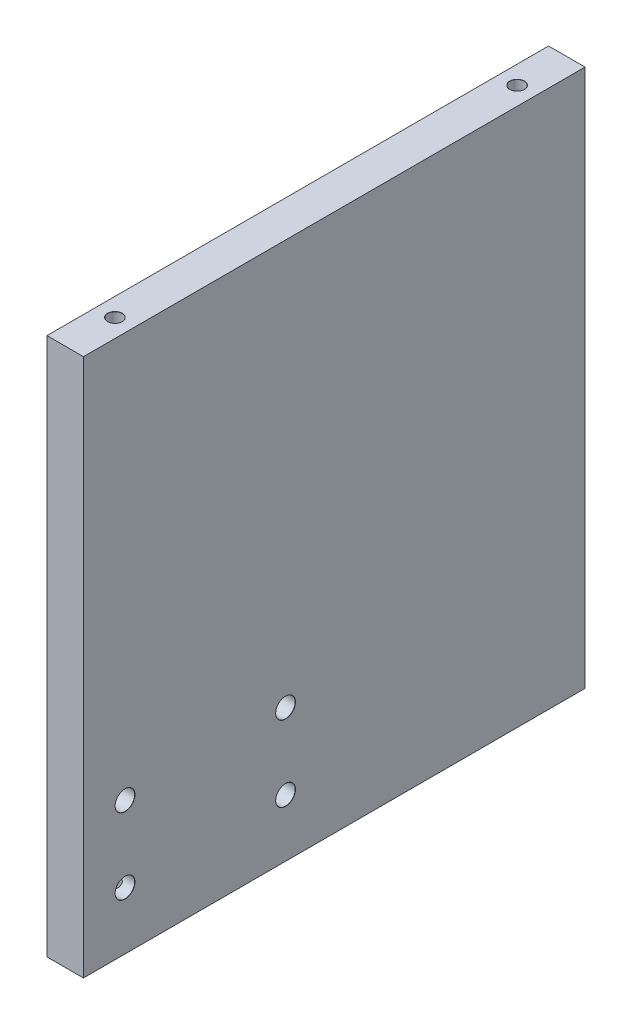
ISO-10303-21;
HEADER;
FILE_DESCRIPTION(('STEP AP214'),'2;1');
FILE_NAME('part.step','',(''),(''),'','','');
FILE_SCHEMA(('AUTOMOTIVE_DESIGN { 1 0 10303 214 1 1 1 1 }'));
ENDSEC;
DATA;
#1=APPLICATION_CONTEXT('core data for automotive mechanical design processes');
#2=APPLICATION_PROTOCOL_DEFINITION('international standard','automotive_design',2000,#1);
#3=PRODUCT_CONTEXT('',#1,'mechanical');
#4=PRODUCT('Part','Part','',(#3));
#5=PRODUCT_RELATED_PRODUCT_CATEGORY('part','',(#4));
#6=PRODUCT_DEFINITION_FORMATION('','',#4);
#7=PRODUCT_DEFINITION_CONTEXT('part definition',#1,'design');
#8=PRODUCT_DEFINITION('design','',#6,#7);
#9=PRODUCT_DEFINITION_SHAPE('','',#8);
#10=(LENGTH_UNIT() NAMED_UNIT(*) SI_UNIT(.MILLI.,.METRE.));
#11=(NAMED_UNIT(*) PLANE_ANGLE_UNIT() SI_UNIT($,.RADIAN.));
#12=(NAMED_UNIT(*) SI_UNIT($,.STERADIAN.) SOLID_ANGLE_UNIT());
#13=UNCERTAINTY_MEASURE_WITH_UNIT(LENGTH_MEASURE(1.E-05),#10,'distance_accuracy_value','');
#14=(GEOMETRIC_REPRESENTATION_CONTEXT(3) GLOBAL_UNCERTAINTY_ASSIGNED_CONTEXT((#13)) GLOBAL_UNIT_ASSIGNED_CONTEXT((#10,
#11,#12)) REPRESENTATION_CONTEXT('',''));
#15=CARTESIAN_POINT('',(0.,0.,0.));
#16=DIRECTION('',(0.,0.,1.));
#17=DIRECTION('',(1.,0.,0.));
#18=AXIS2_PLACEMENT_3D('',#15,#16,#17);
#19=CARTESIAN_POINT('',(0.,0.,0.));
#20=DIRECTION('',(-1.,0.,0.));
#21=DIRECTION('',(0.,0.,1.));
#22=AXIS2_PLACEMENT_3D('',#19,#20,#21);
#23=PLANE('',#22);
#24=CARTESIAN_POINT('',(0.,-23.655,36.41));
#25=DIRECTION('',(1.,0.,0.));
#26=DIRECTION('',(0.,0.,-1.));
#27=AXIS2_PLACEMENT_3D('',#24,#25,#26);
#28=CIRCLE('',#27,1.7);
#29=CARTESIAN_POINT('',(0.,-23.655,34.71));
#30=VERTEX_POINT('',#29);
#31=EDGE_CURVE('E507',#30,#30,#28,.T.);
#32=ORIENTED_EDGE('',*,*,#31,.T.);
#33=EDGE_LOOP('',(#32));
#34=FACE_BOUND('',#33,.T.);
#35=DIRECTION('',(0.,1.,0.));
#36=VECTOR('',#35,1.);
#37=CARTESIAN_POINT('',(0.,-46.825,-43.65));
#38=LINE('',#37,#36);
#39=CARTESIAN_POINT('',(0.,-46.825,-43.65));
#40=VERTEX_POINT('',#39);
#41=CARTESIAN_POINT('',(0.,46.825,-43.65));
#42=VERTEX_POINT('',#41);
#43=EDGE_CURVE('E176',#40,#42,#38,.T.);
#44=ORIENTED_EDGE('',*,*,#43,.F.);
#45=DIRECTION('',(0.,0.,-1.));
#46=VECTOR('',#45,1.);
#47=CARTESIAN_POINT('',(0.,-46.825,43.65));
#48=LINE('',#47,#46);
#49=CARTESIAN_POINT('',(0.,-46.825,43.65));
#50=VERTEX_POINT('',#49);
#51=EDGE_CURVE('E100',#50,#40,#48,.T.);
#52=ORIENTED_EDGE('',*,*,#51,.F.);
#53=DIRECTION('',(0.,-1.,0.));
#54=VECTOR('',#53,1.);
#55=CARTESIAN_POINT('',(0.,-46.825,43.65));
#56=LINE('',#55,#54);
#57=CARTESIAN_POINT('',(0.,46.825,43.65));
#58=VERTEX_POINT('',#57);
#59=EDGE_CURVE('E194',#58,#50,#56,.T.);
#60=ORIENTED_EDGE('',*,*,#59,.F.);
#61=DIRECTION('',(0.,0.,1.));
#62=VECTOR('',#61,1.);
#63=CARTESIAN_POINT('',(0.,46.825,43.65));
#64=LINE('',#63,#62);
#65=EDGE_CURVE('E191',#42,#58,#64,.T.);
#66=ORIENTED_EDGE('',*,*,#65,.F.);
#67=EDGE_LOOP('',(#44,#52,#60,#66));
#68=FACE_BOUND('',#67,.T.);
#69=CARTESIAN_POINT('',(0.,-36.825,36.41));
#70=DIRECTION('',(1.,0.,0.));
#71=DIRECTION('',(0.,0.,-1.));
#72=AXIS2_PLACEMENT_3D('',#69,#70,#71);
#73=CIRCLE('',#72,1.7);
#74=CARTESIAN_POINT('',(0.,-36.825,34.71));
#75=VERTEX_POINT('',#74);
#76=EDGE_CURVE('E128',#75,#75,#73,.T.);
#77=ORIENTED_EDGE('',*,*,#76,.T.);
#78=EDGE_LOOP('',(#77));
#79=FACE_BOUND('',#78,.T.);
#80=CARTESIAN_POINT('',(0.,-36.825,8.47));
#81=DIRECTION('',(1.,0.,0.));
#82=DIRECTION('',(0.,0.,-1.));
#83=AXIS2_PLACEMENT_3D('',#80,#81,#82);
#84=CIRCLE('',#83,1.7);
#85=CARTESIAN_POINT('',(0.,-36.825,6.77));
#86=VERTEX_POINT('',#85);
#87=EDGE_CURVE('E237',#86,#86,#84,.T.);
#88=ORIENTED_EDGE('',*,*,#87,.T.);
#89=EDGE_LOOP('',(#88));
#90=FACE_BOUND('',#89,.T.);
#91=CARTESIAN_POINT('',(0.,-23.655,8.47));
#92=DIRECTION('',(1.,0.,0.));
#93=DIRECTION('',(0.,0.,-1.));
#94=AXIS2_PLACEMENT_3D('',#91,#92,#93);
#95=CIRCLE('',#94,1.7);
#96=CARTESIAN_POINT('',(0.,-23.655,6.77));
#97=VERTEX_POINT('',#96);
#98=EDGE_CURVE('E232',#97,#97,#95,.T.);
#99=ORIENTED_EDGE('',*,*,#98,.T.);
#100=EDGE_LOOP('',(#99));
#101=FACE_BOUND('',#100,.T.);
#102=ADVANCED_FACE('F50',(#34,#68,#79,#90,#101),#23,.T.);
#103=CARTESIAN_POINT('',(6.35,0.,0.));
#104=DIRECTION('',(-1.,0.,0.));
#105=DIRECTION('',(0.,0.,1.));
#106=AXIS2_PLACEMENT_3D('',#103,#104,#105);
#107=PLANE('',#106);
#108=CARTESIAN_POINT('',(6.35,-23.655,36.41));
#109=DIRECTION('',(1.,0.,0.));
#110=DIRECTION('',(0.,0.,-1.));
#111=AXIS2_PLACEMENT_3D('',#108,#109,#110);
#112=CIRCLE('',#111,1.725);
#113=CARTESIAN_POINT('',(6.35,-23.655,34.685));
#114=VERTEX_POINT('',#113);
#115=EDGE_CURVE('E503',#114,#114,#112,.T.);
#116=ORIENTED_EDGE('',*,*,#115,.F.);
#117=EDGE_LOOP('',(#116));
#118=FACE_BOUND('',#117,.T.);
#119=CARTESIAN_POINT('',(6.35,-23.655,8.47));
#120=DIRECTION('',(1.,0.,0.));
#121=DIRECTION('',(0.,0.,-1.));
#122=AXIS2_PLACEMENT_3D('',#119,#120,#121);
#123=CIRCLE('',#122,1.725);
#124=CARTESIAN_POINT('',(6.35,-23.655,6.745));
#125=VERTEX_POINT('',#124);
#126=EDGE_CURVE('E512',#125,#125,#123,.T.);
#127=ORIENTED_EDGE('',*,*,#126,.F.);
#128=EDGE_LOOP('',(#127));
#129=FACE_BOUND('',#128,.T.);
#130=CARTESIAN_POINT('',(6.35,-36.825,36.41));
#131=DIRECTION('',(1.,0.,0.));
#132=DIRECTION('',(0.,0.,-1.));
#133=AXIS2_PLACEMENT_3D('',#130,#131,#132);
#134=CIRCLE('',#133,1.725);
#135=CARTESIAN_POINT('',(6.35,-36.825,34.685));
#136=VERTEX_POINT('',#135);
#137=EDGE_CURVE('E247',#136,#136,#134,.T.);
#138=ORIENTED_EDGE('',*,*,#137,.F.);
#139=EDGE_LOOP('',(#138));
#140=FACE_BOUND('',#139,.T.);
#141=DIRECTION('',(0.,1.,0.));
#142=VECTOR('',#141,1.);
#143=CARTESIAN_POINT('',(6.35,-46.825,-43.65));
#144=LINE('',#143,#142);
#145=CARTESIAN_POINT('',(6.35,-46.825,-43.65));
#146=VERTEX_POINT('',#145);
#147=CARTESIAN_POINT('',(6.35,46.825,-43.65));
#148=VERTEX_POINT('',#147);
#149=EDGE_CURVE('E177',#146,#148,#144,.T.);
#150=ORIENTED_EDGE('',*,*,#149,.T.);
#151=DIRECTION('',(0.,0.,1.));
#152=VECTOR('',#151,1.);
#153=CARTESIAN_POINT('',(6.35,46.825,43.65));
#154=LINE('',#153,#152);
#155=CARTESIAN_POINT('',(6.35,46.825,43.65));
#156=VERTEX_POINT('',#155);
#157=EDGE_CURVE('E108',#148,#156,#154,.T.);
#158=ORIENTED_EDGE('',*,*,#157,.T.);
#159=DIRECTION('',(0.,-1.,0.));
#160=VECTOR('',#159,1.);
#161=CARTESIAN_POINT('',(6.35,-46.825,43.65));
#162=LINE('',#161,#160);
#163=CARTESIAN_POINT('',(6.35,-46.825,43.65));
#164=VERTEX_POINT('',#163);
#165=EDGE_CURVE('E182',#156,#164,#162,.T.);
#166=ORIENTED_EDGE('',*,*,#165,.T.);
#167=DIRECTION('',(0.,0.,-1.));
#168=VECTOR('',#167,1.);
#169=CARTESIAN_POINT('',(6.35,-46.825,43.65));
#170=LINE('',#169,#168);
#171=EDGE_CURVE('E79',#164,#146,#170,.T.);
#172=ORIENTED_EDGE('',*,*,#171,.T.);
#173=EDGE_LOOP('',(#150,#158,#166,#172));
#174=FACE_BOUND('',#173,.T.);
#175=CARTESIAN_POINT('',(6.35,-36.825,8.47));
#176=DIRECTION('',(1.,0.,0.));
#177=DIRECTION('',(0.,0.,-1.));
#178=AXIS2_PLACEMENT_3D('',#175,#176,#177);
#179=CIRCLE('',#178,1.725);
#180=CARTESIAN_POINT('',(6.35,-36.825,6.74499999999999));
#181=VERTEX_POINT('',#180);
#182=EDGE_CURVE('E228',#181,#181,#179,.T.);
#183=ORIENTED_EDGE('',*,*,#182,.F.);
#184=EDGE_LOOP('',(#183));
#185=FACE_BOUND('',#184,.T.);
#186=ADVANCED_FACE('F221',(#118,#129,#140,#174,#185),#107,.F.);
#187=CARTESIAN_POINT('',(6.35,-46.825,-43.65));
#188=DIRECTION('',(0.,0.,1.));
#189=DIRECTION('',(1.,0.,0.));
#190=AXIS2_PLACEMENT_3D('',#187,#188,#189);
#191=PLANE('',#190);
#192=ORIENTED_EDGE('',*,*,#43,.T.);
#193=DIRECTION('',(-1.,0.,0.));
#194=VECTOR('',#193,1.);
#195=CARTESIAN_POINT('',(6.35,46.825,-43.65));
#196=LINE('',#195,#194);
#197=EDGE_CURVE('E65',#148,#42,#196,.T.);
#198=ORIENTED_EDGE('',*,*,#197,.F.);
#199=ORIENTED_EDGE('',*,*,#149,.F.);
#200=DIRECTION('',(-1.,0.,0.));
#201=VECTOR('',#200,1.);
#202=CARTESIAN_POINT('',(6.35,-46.825,-43.65));
#203=LINE('',#202,#201);
#204=EDGE_CURVE('E187',#146,#40,#203,.T.);
#205=ORIENTED_EDGE('',*,*,#204,.T.);
#206=EDGE_LOOP('',(#192,#198,#199,#205));
#207=FACE_BOUND('',#206,.T.);
#208=ADVANCED_FACE('F52',(#207),#191,.F.);
#209=CARTESIAN_POINT('',(6.35,46.825,43.65));
#210=DIRECTION('',(0.,-1.,0.));
#211=DIRECTION('',(0.,0.,-1.));
#212=AXIS2_PLACEMENT_3D('',#209,#210,#211);
#213=PLANE('',#212);
#214=CARTESIAN_POINT('',(3.175,46.825,-35.));
#215=DIRECTION('',(0.,1.,0.));
#216=DIRECTION('',(0.,0.,1.));
#217=AXIS2_PLACEMENT_3D('',#214,#215,#216);
#218=CIRCLE('',#217,1.275);
#219=CARTESIAN_POINT('',(3.175,46.825,-33.725));
#220=VERTEX_POINT('',#219);
#221=EDGE_CURVE('E152',#220,#220,#218,.T.);
#222=ORIENTED_EDGE('',*,*,#221,.F.);
#223=EDGE_LOOP('',(#222));
#224=FACE_BOUND('',#223,.T.);
#225=CARTESIAN_POINT('',(3.17500000000001,46.825,35.));
#226=DIRECTION('',(0.,1.,0.));
#227=DIRECTION('',(0.,0.,1.));
#228=AXIS2_PLACEMENT_3D('',#225,#226,#227);
#229=CIRCLE('',#228,1.275);
#230=CARTESIAN_POINT('',(3.17500000000001,46.825,36.275));
#231=VERTEX_POINT('',#230);
#232=EDGE_CURVE('E164',#231,#231,#229,.T.);
#233=ORIENTED_EDGE('',*,*,#232,.F.);
#234=EDGE_LOOP('',(#233));
#235=FACE_BOUND('',#234,.T.);
#236=ORIENTED_EDGE('',*,*,#65,.T.);
#237=DIRECTION('',(-1.,0.,0.));
#238=VECTOR('',#237,1.);
#239=CARTESIAN_POINT('',(6.35,46.825,43.65));
#240=LINE('',#239,#238);
#241=EDGE_CURVE('E204',#156,#58,#240,.T.);
#242=ORIENTED_EDGE('',*,*,#241,.F.);
#243=ORIENTED_EDGE('',*,*,#157,.F.);
#244=ORIENTED_EDGE('',*,*,#197,.T.);
#245=EDGE_LOOP('',(#236,#242,#243,#244));
#246=FACE_BOUND('',#245,.T.);
#247=ADVANCED_FACE('F209',(#224,#235,#246),#213,.F.);
#248=CARTESIAN_POINT('',(6.35,-46.825,43.65));
#249=DIRECTION('',(0.,0.,-1.));
#250=DIRECTION('',(-1.,0.,0.));
#251=AXIS2_PLACEMENT_3D('',#248,#249,#250);
#252=PLANE('',#251);
#253=ORIENTED_EDGE('',*,*,#59,.T.);
#254=DIRECTION('',(-1.,0.,0.));
#255=VECTOR('',#254,1.);
#256=CARTESIAN_POINT('',(6.35,-46.825,43.65));
#257=LINE('',#256,#255);
#258=EDGE_CURVE('E201',#164,#50,#257,.T.);
#259=ORIENTED_EDGE('',*,*,#258,.F.);
#260=ORIENTED_EDGE('',*,*,#165,.F.);
#261=ORIENTED_EDGE('',*,*,#241,.T.);
#262=EDGE_LOOP('',(#253,#259,#260,#261));
#263=FACE_BOUND('',#262,.T.);
#264=ADVANCED_FACE('F218',(#263),#252,.F.);
#265=CARTESIAN_POINT('',(6.35,-46.825,43.65));
#266=DIRECTION('',(0.,1.,0.));
#267=DIRECTION('',(0.,0.,1.));
#268=AXIS2_PLACEMENT_3D('',#265,#266,#267);
#269=PLANE('',#268);
#270=CARTESIAN_POINT('',(3.17500000000001,-46.825,35.));
#271=DIRECTION('',(0.,-1.,0.));
#272=DIRECTION('',(0.,0.,-1.));
#273=AXIS2_PLACEMENT_3D('',#270,#271,#272);
#274=CIRCLE('',#273,1.275);
#275=CARTESIAN_POINT('',(3.17500000000001,-46.825,33.725));
#276=VERTEX_POINT('',#275);
#277=EDGE_CURVE('E127',#276,#276,#274,.T.);
#278=ORIENTED_EDGE('',*,*,#277,.F.);
#279=EDGE_LOOP('',(#278));
#280=FACE_BOUND('',#279,.T.);
#281=CARTESIAN_POINT('',(3.175,-46.825,-35.));
#282=DIRECTION('',(0.,-1.,0.));
#283=DIRECTION('',(0.,0.,-1.));
#284=AXIS2_PLACEMENT_3D('',#281,#282,#283);
#285=CIRCLE('',#284,1.275);
#286=CARTESIAN_POINT('',(3.175,-46.825,-36.275));
#287=VERTEX_POINT('',#286);
#288=EDGE_CURVE('E133',#287,#287,#285,.T.);
#289=ORIENTED_EDGE('',*,*,#288,.F.);
#290=EDGE_LOOP('',(#289));
#291=FACE_BOUND('',#290,.T.);
#292=ORIENTED_EDGE('',*,*,#51,.T.);
#293=ORIENTED_EDGE('',*,*,#204,.F.);
#294=ORIENTED_EDGE('',*,*,#171,.F.);
#295=ORIENTED_EDGE('',*,*,#258,.T.);
#296=EDGE_LOOP('',(#292,#293,#294,#295));
#297=FACE_BOUND('',#296,.T.);
#298=ADVANCED_FACE('F220',(#280,#291,#297),#269,.F.);
#299=CARTESIAN_POINT('',(3.17500000000001,36.825,35.));
#300=DIRECTION('',(0.,1.,0.));
#301=DIRECTION('',(0.,0.,1.));
#302=AXIS2_PLACEMENT_3D('',#299,#300,#301);
#303=CONICAL_SURFACE('',#302,1.24999999999999,1.02974425867665);
#304=CARTESIAN_POINT('',(3.17500000000001,36.0739242262155,35.));
#305=VERTEX_POINT('',#304);
#306=VERTEX_LOOP('',#305);
#307=FACE_BOUND('',#306,.T.);
#308=CARTESIAN_POINT('',(3.17500000000001,36.825,35.));
#309=DIRECTION('',(0.,1.,0.));
#310=DIRECTION('',(0.,0.,1.));
#311=AXIS2_PLACEMENT_3D('',#308,#309,#310);
#312=CIRCLE('',#311,1.24999999999999);
#313=CARTESIAN_POINT('',(3.17500000000001,36.825,36.25));
#314=VERTEX_POINT('',#313);
#315=EDGE_CURVE('E172',#314,#314,#312,.T.);
#316=ORIENTED_EDGE('',*,*,#315,.T.);
#317=EDGE_LOOP('',(#316));
#318=FACE_BOUND('',#317,.T.);
#319=ADVANCED_FACE('F291',(#307,#318),#303,.F.);
#320=CARTESIAN_POINT('',(3.17500000000001,46.825,35.));
#321=DIRECTION('',(0.,1.,0.));
#322=DIRECTION('',(0.,0.,1.));
#323=AXIS2_PLACEMENT_3D('',#320,#321,#322);
#324=CYLINDRICAL_SURFACE('',#323,1.24999999999999);
#325=ORIENTED_EDGE('',*,*,#315,.F.);
#326=EDGE_LOOP('',(#325));
#327=FACE_BOUND('',#326,.T.);
#328=CARTESIAN_POINT('',(3.17500000000001,46.8,35.));
#329=DIRECTION('',(0.,1.,0.));
#330=DIRECTION('',(0.,0.,1.));
#331=AXIS2_PLACEMENT_3D('',#328,#329,#330);
#332=CIRCLE('',#331,1.24999999999999);
#333=CARTESIAN_POINT('',(3.17500000000001,46.8,36.25));
#334=VERTEX_POINT('',#333);
#335=EDGE_CURVE('E168',#334,#334,#332,.T.);
#336=ORIENTED_EDGE('',*,*,#335,.T.);
#337=EDGE_LOOP('',(#336));
#338=FACE_BOUND('',#337,.T.);
#339=ADVANCED_FACE('F306',(#327,#338),#324,.F.);
#340=CARTESIAN_POINT('',(3.17500000000001,46.825,35.));
#341=DIRECTION('',(0.,1.,0.));
#342=DIRECTION('',(0.,0.,1.));
#343=AXIS2_PLACEMENT_3D('',#340,#341,#342);
#344=CONICAL_SURFACE('',#343,1.275,0.785398163398003);
#345=ORIENTED_EDGE('',*,*,#335,.F.);
#346=EDGE_LOOP('',(#345));
#347=FACE_BOUND('',#346,.T.);
#348=ORIENTED_EDGE('',*,*,#232,.T.);
#349=EDGE_LOOP('',(#348));
#350=FACE_BOUND('',#349,.T.);
#351=ADVANCED_FACE('F303',(#347,#350),#344,.F.);
#352=CARTESIAN_POINT('',(3.175,36.825,-35.));
#353=DIRECTION('',(0.,1.,0.));
#354=DIRECTION('',(0.,0.,1.));
#355=AXIS2_PLACEMENT_3D('',#352,#353,#354);
#356=CONICAL_SURFACE('',#355,1.24999999999999,1.02974425867665);
#357=CARTESIAN_POINT('',(3.175,36.0739242262155,-35.));
#358=VERTEX_POINT('',#357);
#359=VERTEX_LOOP('',#358);
#360=FACE_BOUND('',#359,.T.);
#361=CARTESIAN_POINT('',(3.175,36.825,-35.));
#362=DIRECTION('',(0.,1.,0.));
#363=DIRECTION('',(0.,0.,1.));
#364=AXIS2_PLACEMENT_3D('',#361,#362,#363);
#365=CIRCLE('',#364,1.24999999999999);
#366=CARTESIAN_POINT('',(3.175,36.825,-33.75));
#367=VERTEX_POINT('',#366);
#368=EDGE_CURVE('E160',#367,#367,#365,.T.);
#369=ORIENTED_EDGE('',*,*,#368,.T.);
#370=EDGE_LOOP('',(#369));
#371=FACE_BOUND('',#370,.T.);
#372=ADVANCED_FACE('F305',(#360,#371),#356,.F.);
#373=CARTESIAN_POINT('',(3.175,46.825,-35.));
#374=DIRECTION('',(0.,1.,0.));
#375=DIRECTION('',(0.,0.,1.));
#376=AXIS2_PLACEMENT_3D('',#373,#374,#375);
#377=CYLINDRICAL_SURFACE('',#376,1.24999999999999);
#378=ORIENTED_EDGE('',*,*,#368,.F.);
#379=EDGE_LOOP('',(#378));
#380=FACE_BOUND('',#379,.T.);
#381=CARTESIAN_POINT('',(3.175,46.8,-35.));
#382=DIRECTION('',(0.,1.,0.));
#383=DIRECTION('',(0.,0.,1.));
#384=AXIS2_PLACEMENT_3D('',#381,#382,#383);
#385=CIRCLE('',#384,1.24999999999999);
#386=CARTESIAN_POINT('',(3.175,46.8,-33.75));
#387=VERTEX_POINT('',#386);
#388=EDGE_CURVE('E156',#387,#387,#385,.T.);
#389=ORIENTED_EDGE('',*,*,#388,.T.);
#390=EDGE_LOOP('',(#389));
#391=FACE_BOUND('',#390,.T.);
#392=ADVANCED_FACE('F313',(#380,#391),#377,.F.);
#393=CARTESIAN_POINT('',(3.175,46.825,-35.));
#394=DIRECTION('',(0.,1.,0.));
#395=DIRECTION('',(0.,0.,1.));
#396=AXIS2_PLACEMENT_3D('',#393,#394,#395);
#397=CONICAL_SURFACE('',#396,1.275,0.785398163398003);
#398=ORIENTED_EDGE('',*,*,#388,.F.);
#399=EDGE_LOOP('',(#398));
#400=FACE_BOUND('',#399,.T.);
#401=ORIENTED_EDGE('',*,*,#221,.T.);
#402=EDGE_LOOP('',(#401));
#403=FACE_BOUND('',#402,.T.);
#404=ADVANCED_FACE('F352',(#400,#403),#397,.F.);
#405=CARTESIAN_POINT('',(3.175,-37.5760757737845,-35.));
#406=DIRECTION('',(0.,-1.,0.));
#407=DIRECTION('',(0.,0.,-1.));
#408=AXIS2_PLACEMENT_3D('',#405,#406,#407);
#409=CONICAL_SURFACE('',#408,1.25,1.02974425867665);
#410=CARTESIAN_POINT('',(3.175,-36.825,-35.));
#411=VERTEX_POINT('',#410);
#412=VERTEX_LOOP('',#411);
#413=FACE_BOUND('',#412,.T.);
#414=CARTESIAN_POINT('',(3.175,-37.5760757737845,-35.));
#415=DIRECTION('',(0.,-1.,0.));
#416=DIRECTION('',(0.,0.,-1.));
#417=AXIS2_PLACEMENT_3D('',#414,#415,#416);
#418=CIRCLE('',#417,1.25);
#419=CARTESIAN_POINT('',(3.175,-37.5760757737845,-36.25));
#420=VERTEX_POINT('',#419);
#421=EDGE_CURVE('E148',#420,#420,#418,.T.);
#422=ORIENTED_EDGE('',*,*,#421,.T.);
#423=EDGE_LOOP('',(#422));
#424=FACE_BOUND('',#423,.T.);
#425=ADVANCED_FACE('F360',(#413,#424),#409,.F.);
#426=CARTESIAN_POINT('',(3.175,-46.825,-35.));
#427=DIRECTION('',(0.,-1.,0.));
#428=DIRECTION('',(0.,0.,-1.));
#429=AXIS2_PLACEMENT_3D('',#426,#427,#428);
#430=CYLINDRICAL_SURFACE('',#429,1.24999999999999);
#431=ORIENTED_EDGE('',*,*,#421,.F.);
#432=EDGE_LOOP('',(#431));
#433=FACE_BOUND('',#432,.T.);
#434=CARTESIAN_POINT('',(3.175,-46.8,-35.));
#435=DIRECTION('',(0.,-1.,0.));
#436=DIRECTION('',(0.,0.,-1.));
#437=AXIS2_PLACEMENT_3D('',#434,#435,#436);
#438=CIRCLE('',#437,1.24999999999999);
#439=CARTESIAN_POINT('',(3.175,-46.8,-36.25));
#440=VERTEX_POINT('',#439);
#441=EDGE_CURVE('E139',#440,#440,#438,.T.);
#442=ORIENTED_EDGE('',*,*,#441,.T.);
#443=EDGE_LOOP('',(#442));
#444=FACE_BOUND('',#443,.T.);
#445=ADVANCED_FACE('F376',(#433,#444),#430,.F.);
#446=CARTESIAN_POINT('',(3.175,-46.825,-35.));
#447=DIRECTION('',(0.,-1.,0.));
#448=DIRECTION('',(0.,0.,-1.));
#449=AXIS2_PLACEMENT_3D('',#446,#447,#448);
#450=CONICAL_SURFACE('',#449,1.275,0.785398163398003);
#451=ORIENTED_EDGE('',*,*,#441,.F.);
#452=EDGE_LOOP('',(#451));
#453=FACE_BOUND('',#452,.T.);
#454=ORIENTED_EDGE('',*,*,#288,.T.);
#455=EDGE_LOOP('',(#454));
#456=FACE_BOUND('',#455,.T.);
#457=ADVANCED_FACE('F280',(#453,#456),#450,.F.);
#458=CARTESIAN_POINT('',(3.17500000000001,-37.5760757737845,35.));
#459=DIRECTION('',(0.,-1.,0.));
#460=DIRECTION('',(0.,0.,-1.));
#461=AXIS2_PLACEMENT_3D('',#458,#459,#460);
#462=CONICAL_SURFACE('',#461,1.25,1.02974425867665);
#463=CARTESIAN_POINT('',(3.17500000000001,-37.5760757737845,35.));
#464=DIRECTION('',(0.,-1.,0.));
#465=DIRECTION('',(0.,0.,-1.));
#466=AXIS2_PLACEMENT_3D('',#463,#464,#465);
#467=CIRCLE('',#466,1.25);
#468=CARTESIAN_POINT('',(1.93030912553055,-37.5760757737845,34.8849146968008));
#469=VERTEX_POINT('',#468);
#470=CARTESIAN_POINT('',(4.41969087446947,-37.5760757737845,34.8849146968008));
#471=VERTEX_POINT('',#470);
#472=EDGE_CURVE('E125',#469,#471,#467,.T.);
#473=ORIENTED_EDGE('',*,*,#472,.T.);
#474=CARTESIAN_POINT('',(4.5482519324564,-37.6513833511629,34.9243719991462));
#475=CARTESIAN_POINT('',(4.48966894197044,-37.6168864458839,34.9051897347459));
#476=CARTESIAN_POINT('',(4.43061584579635,-37.5823540318382,34.8875474602423));
#477=CARTESIAN_POINT('',(4.31167708449785,-37.5133717158669,34.8551360038113));
#478=CARTESIAN_POINT('',(4.25179142037982,-37.4789218138414,34.8403668184113));
#479=CARTESIAN_POINT('',(4.13180861807127,-37.4105506349355,34.8136091456477));
#480=CARTESIAN_POINT('',(4.07171763448946,-37.376627355173,34.8015980270874));
#481=CARTESIAN_POINT('',(3.95081786149955,-37.3092930025081,34.7800584129169));
#482=CARTESIAN_POINT('',(3.89000914864855,-37.275881875835,34.7705296549812));
#483=CARTESIAN_POINT('',(3.77296782664716,-37.2130480119731,34.7545944778081));
#484=CARTESIAN_POINT('',(3.71681175718841,-37.1835356324868,34.7479851603364));
#485=CARTESIAN_POINT('',(3.63150846695653,-37.1406745219786,34.7395014519175));
#486=CARTESIAN_POINT('',(3.60280757455852,-37.1265816737018,34.7369062787972));
#487=CARTESIAN_POINT('',(3.54498069987897,-37.0992138878237,34.7322043646768));
#488=CARTESIAN_POINT('',(3.51585479814558,-37.0859387976677,34.7300975323718));
#489=CARTESIAN_POINT('',(3.46768889529289,-37.0653392764679,34.7270552680238));
#490=CARTESIAN_POINT('',(3.4488360446484,-37.0576074856911,34.7259725720483));
#491=CARTESIAN_POINT('',(3.41081412990956,-37.042942015139,34.7240118271715));
#492=CARTESIAN_POINT('',(3.39164494376591,-37.0360086520547,34.7231338593337));
#493=CARTESIAN_POINT('',(3.33388156256302,-37.0170336892066,34.7208337587047));
#494=CARTESIAN_POINT('',(3.29463946690397,-37.0066347782987,34.7197201513774));
#495=CARTESIAN_POINT('',(3.2389615037138,-36.9980216835262,34.7188258364755));
#496=CARTESIAN_POINT('',(3.2230929553888,-36.9962420253781,34.7186463335614));
#497=CARTESIAN_POINT('',(3.19125843440426,-36.9941934782372,34.7184401779189));
#498=CARTESIAN_POINT('',(3.17529249481179,-36.9939241022446,34.7184134759188));
#499=CARTESIAN_POINT('',(3.14334676616892,-36.9949282855244,34.7185140952434));
#500=CARTESIAN_POINT('',(3.12736718382692,-36.9962081103646,34.7186420420245));
#501=CARTESIAN_POINT('',(3.09558726523328,-37.0001777088737,34.7190485585764));
#502=CARTESIAN_POINT('',(3.07978698487783,-37.0028679105165,34.7193271740678));
#503=CARTESIAN_POINT('',(3.02782078449394,-37.0136964422881,34.7204883456011));
#504=CARTESIAN_POINT('',(2.99219909277185,-37.0243468820449,34.7216832775395));
#505=CARTESIAN_POINT('',(2.92212535001434,-37.0489215572478,34.7247660956026));
#506=CARTESIAN_POINT('',(2.88767739711081,-37.0628561380216,34.7266561822932));
#507=CARTESIAN_POINT('',(2.81895507861511,-37.0926915723812,34.7311389397176));
#508=CARTESIAN_POINT('',(2.78469506198657,-37.1086233695077,34.7337436729333));
#509=CARTESIAN_POINT('',(2.71676972081753,-37.1414405045311,34.739627672604));
#510=CARTESIAN_POINT('',(2.683103552706,-37.1583243177233,34.7429058815304));
#511=CARTESIAN_POINT('',(2.61200804274943,-37.1947933652648,34.7505899088021));
#512=CARTESIAN_POINT('',(2.57462745209281,-37.2144547030722,34.7550849881285));
#513=CARTESIAN_POINT('',(2.50021512398495,-37.2542152731293,34.7649484252118));
#514=CARTESIAN_POINT('',(2.46318341100123,-37.274314535769,34.7703168437425));
#515=CARTESIAN_POINT('',(2.35246390925989,-37.3350422043093,34.7877701202055));
#516=CARTESIAN_POINT('',(2.27920339175639,-37.3760733396343,34.8011974469428));
#517=CARTESIAN_POINT('',(2.13797588019884,-37.4561277740443,34.8309496290136));
#518=CARTESIAN_POINT('',(2.0699502639385,-37.4951278291584,34.8470585740476));
#519=CARTESIAN_POINT('',(1.93500223276947,-37.5732293382986,34.8829150568983));
#520=CARTESIAN_POINT('',(1.86807899006972,-37.6123306880898,34.9026597148947));
#521=CARTESIAN_POINT('',(1.80174806754349,-37.6513833511627,34.9243719991458));
#522=B_SPLINE_CURVE_WITH_KNOTS('',3,(#474,#475,#476,#477,#478,#479,#480,#481,#482,#483,#484,
#485,#486,#487,#488,#489,#490,#491,#492,#493,#494,#495,#496,#497,#498,#499,#500,#501,#502,#503,
#504,#505,#506,#507,#508,#509,#510,#511,#512,#513,#514,#515,#516,#517,#518,#519,#520,#521),
.UNSPECIFIED.,.F.,.F.,(4,2,2,2,2,2,2,2,2,2,2,2,2,2,2,2,2,2,2,2,2,2,2,4),(0.,0.21188455132161,
0.423768846543173,0.63384690307082,0.843902750413992,1.03519168035679,1.1314188328905,
1.22762797931333,1.28882259774086,1.35004140560944,1.47118209604341,1.51902530993367,
1.56685309559629,1.61487496333824,1.6629114115858,1.77412214695909,1.88568800186323,
1.99926702863342,2.11266905219012,2.24007668230099,2.36749318224118,2.62250181775725,
2.86256659243677,3.10244202529965),.UNSPECIFIED.);
#523=EDGE_CURVE('E71',#471,#469,#522,.T.);
#524=ORIENTED_EDGE('',*,*,#523,.T.);
#525=EDGE_LOOP('',(#473,#524));
#526=FACE_BOUND('',#525,.T.);
#527=ADVANCED_FACE('F124',(#526),#462,.F.);
#528=CARTESIAN_POINT('',(3.17500000000001,-46.825,35.));
#529=DIRECTION('',(0.,-1.,0.));
#530=DIRECTION('',(0.,0.,-1.));
#531=AXIS2_PLACEMENT_3D('',#528,#529,#530);
#532=CYLINDRICAL_SURFACE('',#531,1.24999999999999);
#533=ORIENTED_EDGE('',*,*,#472,.F.);
#534=CARTESIAN_POINT('',(1.93030912553055,-37.5760757737845,34.8849146968008));
#535=CARTESIAN_POINT('',(1.92860307695621,-37.6136717717183,34.9034260094695));
#536=CARTESIAN_POINT('',(1.92717284770761,-37.6505975616873,34.9233426098099));
#537=CARTESIAN_POINT('',(1.92528247285399,-37.7229369852145,34.9658846829935));
#538=CARTESIAN_POINT('',(1.92482347263129,-37.7583487851612,34.9885133209982));
#539=CARTESIAN_POINT('',(1.9253015583423,-37.827624123144,35.0364895475625));
#540=CARTESIAN_POINT('',(1.9262477732115,-37.8614760511903,35.0618539137271));
#541=CARTESIAN_POINT('',(1.93001270098005,-37.9271140386563,35.1149600494412));
#542=CARTESIAN_POINT('',(1.93283041036183,-37.9589011952083,35.1427005379458));
#543=CARTESIAN_POINT('',(1.94328150487892,-38.0391063311186,35.2181283947665));
#544=CARTESIAN_POINT('',(1.95281330241163,-38.085687688692,35.267564500305));
#545=CARTESIAN_POINT('',(1.97989687880526,-38.1715586508308,35.3701736944181));
#546=CARTESIAN_POINT('',(1.99742134327014,-38.2108724538923,35.4233335378725));
#547=CARTESIAN_POINT('',(2.04207169360546,-38.2818132951073,35.5314217361997));
#548=CARTESIAN_POINT('',(2.06926553675975,-38.3133831839534,35.5863600401325));
#549=CARTESIAN_POINT('',(2.13376369891938,-38.3682739459373,35.6944664628882));
#550=CARTESIAN_POINT('',(2.17107326190496,-38.3915905260726,35.7476336474675));
#551=CARTESIAN_POINT('',(2.25081846484344,-38.4286594262829,35.8437314041612));
#552=CARTESIAN_POINT('',(2.2923287115633,-38.4431500898936,35.8871522070665));
#553=CARTESIAN_POINT('',(2.38197458276681,-38.4671111257607,35.9681215060822));
#554=CARTESIAN_POINT('',(2.43011039066522,-38.4765813590019,36.0056698395641));
#555=CARTESIAN_POINT('',(2.53306799797336,-38.4919300372845,36.0744091031593));
#556=CARTESIAN_POINT('',(2.58803027140005,-38.4977094943479,36.1054109859119));
#557=CARTESIAN_POINT('',(2.70217693335398,-38.5065631069455,36.1588414808631));
#558=CARTESIAN_POINT('',(2.76136258148586,-38.5096364517162,36.1812675225631));
#559=CARTESIAN_POINT('',(2.88688390740234,-38.5142597358787,36.2182246246332));
#560=CARTESIAN_POINT('',(2.95342726829808,-38.5156836311603,36.2320685750279));
#561=CARTESIAN_POINT('',(3.08789550245589,-38.5173610295415,36.2488019111374));
#562=CARTESIAN_POINT('',(3.15582063906723,-38.5176143073966,36.2516891886041));
#563=CARTESIAN_POINT('',(3.29327259405835,-38.5171071531708,36.2463469481239));
#564=CARTESIAN_POINT('',(3.36278657359292,-38.5163161833169,36.2377824412359));
#565=CARTESIAN_POINT('',(3.49939499894677,-38.5131586010041,36.2091891640057));
#566=CARTESIAN_POINT('',(3.5664890108319,-38.5107917074261,36.1891583483507));
#567=CARTESIAN_POINT('',(3.69616797443841,-38.5033428992591,36.1382989012877));
#568=CARTESIAN_POINT('',(3.75876078672024,-38.4982658548968,36.1074896731472));
#569=CARTESIAN_POINT('',(3.87760055102459,-38.4837850237092,36.0361694683187));
#570=CARTESIAN_POINT('',(3.93385031438736,-38.4743831631708,35.9956628147427));
#571=CARTESIAN_POINT('',(4.03594465895571,-38.4499804022018,35.9086146798272));
#572=CARTESIAN_POINT('',(4.08212949214363,-38.4352340257235,35.8624022256819));
#573=CARTESIAN_POINT('',(4.16563418424887,-38.3987494688446,35.7650169079465));
#574=CARTESIAN_POINT('',(4.20295998701402,-38.3770159995227,35.7138474028662));
#575=CARTESIAN_POINT('',(4.26574499488597,-38.3276804694835,35.6132200910461));
#576=CARTESIAN_POINT('',(4.29187050037135,-38.3006211532417,35.5639090707174));
#577=CARTESIAN_POINT('',(4.33619890201401,-38.2398858186187,35.4658480837402));
#578=CARTESIAN_POINT('',(4.35440309191164,-38.2062108820317,35.4170980267401));
#579=CARTESIAN_POINT('',(4.38404846631519,-38.1321208456733,35.3213463670745));
#580=CARTESIAN_POINT('',(4.39536399431488,-38.0915968092487,35.2743911013736));
#581=CARTESIAN_POINT('',(4.4121326489059,-38.0049986912804,35.1846407723301));
#582=CARTESIAN_POINT('',(4.41757498787091,-37.9589145691602,35.1418534952101));
#583=CARTESIAN_POINT('',(4.42433387639412,-37.8592185153558,35.0591366216227));
#584=CARTESIAN_POINT('',(4.4253826450823,-37.805320550814,35.0195335929453));
#585=CARTESIAN_POINT('',(4.4243944424549,-37.6935116897204,34.9470790953078));
#586=CARTESIAN_POINT('',(4.42237099706008,-37.6356194482795,34.9141987507874));
#587=CARTESIAN_POINT('',(4.41969087446947,-37.5760757737845,34.8849146968008));
#588=B_SPLINE_CURVE_WITH_KNOTS('',3,(#534,#535,#536,#537,#538,#539,#540,#541,#542,#543,#544,
#545,#546,#547,#548,#549,#550,#551,#552,#553,#554,#555,#556,#557,#558,#559,#560,#561,#562,#563,
#564,#565,#566,#567,#568,#569,#570,#571,#572,#573,#574,#575,#576,#577,#578,#579,#580,#581,#582,
#583,#584,#585,#586,#587),.UNSPECIFIED.,.F.,.F.,(4,2,2,2,2,2,2,2,2,2,2,2,2,2,2,2,2,2,2,2,2,2,2,
2,2,2,4),(0.,0.125805465215465,0.251759211861389,0.378534800515299,0.505242465414718,
0.710110915163409,0.914284427064341,1.11992221255709,1.32566680499676,1.51019417749855,
1.69472665928126,1.88402080612003,2.07337164706603,2.27639683230998,2.47946108103484,
2.6885972296589,2.89777069475595,3.10656952773269,3.31527545095855,3.51512498761397,
3.71484005643887,3.90000863659486,4.08514696292981,4.27356843854226,4.46233541281398,
4.6624537247611,4.86169353461269),.UNSPECIFIED.);
#589=EDGE_CURVE('E13',#469,#471,#588,.T.);
#590=ORIENTED_EDGE('',*,*,#589,.T.);
#591=EDGE_LOOP('',(#533,#590));
#592=FACE_BOUND('',#591,.T.);
#593=CARTESIAN_POINT('',(3.17500000000001,-46.8,35.));
#594=DIRECTION('',(0.,-1.,0.));
#595=DIRECTION('',(0.,0.,-1.));
#596=AXIS2_PLACEMENT_3D('',#593,#594,#595);
#597=CIRCLE('',#596,1.24999999999999);
#598=CARTESIAN_POINT('',(3.17500000000001,-46.8,33.75));
#599=VERTEX_POINT('',#598);
#600=EDGE_CURVE('E134',#599,#599,#597,.T.);
#601=ORIENTED_EDGE('',*,*,#600,.T.);
#602=EDGE_LOOP('',(#601));
#603=FACE_BOUND('',#602,.T.);
#604=ADVANCED_FACE('F130',(#592,#603),#532,.F.);
#605=CARTESIAN_POINT('',(3.17500000000001,-46.825,35.));
#606=DIRECTION('',(0.,-1.,0.));
#607=DIRECTION('',(0.,0.,-1.));
#608=AXIS2_PLACEMENT_3D('',#605,#606,#607);
#609=CONICAL_SURFACE('',#608,1.275,0.785398163398003);
#610=ORIENTED_EDGE('',*,*,#600,.F.);
#611=EDGE_LOOP('',(#610));
#612=FACE_BOUND('',#611,.T.);
#613=ORIENTED_EDGE('',*,*,#277,.T.);
#614=EDGE_LOOP('',(#613));
#615=FACE_BOUND('',#614,.T.);
#616=ADVANCED_FACE('F269',(#612,#615),#609,.F.);
#617=CARTESIAN_POINT('',(6.35,-36.825,36.41));
#618=DIRECTION('',(1.,0.,0.));
#619=DIRECTION('',(0.,0.,-1.));
#620=AXIS2_PLACEMENT_3D('',#617,#618,#619);
#621=CYLINDRICAL_SURFACE('',#620,1.69999999999999);
#622=ORIENTED_EDGE('',*,*,#76,.F.);
#623=EDGE_LOOP('',(#622));
#624=FACE_BOUND('',#623,.T.);
#625=CARTESIAN_POINT('',(6.32499999999997,-36.825,36.41));
#626=DIRECTION('',(1.,0.,0.));
#627=DIRECTION('',(0.,0.,-1.));
#628=AXIS2_PLACEMENT_3D('',#625,#626,#627);
#629=CIRCLE('',#628,1.69999999999999);
#630=CARTESIAN_POINT('',(6.32499999999997,-36.825,34.71));
#631=VERTEX_POINT('',#630);
#632=EDGE_CURVE('E251',#631,#631,#629,.T.);
#633=ORIENTED_EDGE('',*,*,#632,.T.);
#634=EDGE_LOOP('',(#633));
#635=FACE_BOUND('',#634,.T.);
#636=ORIENTED_EDGE('',*,*,#589,.F.);
#637=ORIENTED_EDGE('',*,*,#523,.F.);
#638=EDGE_LOOP('',(#636,#637));
#639=FACE_BOUND('',#638,.T.);
#640=ADVANCED_FACE('F119',(#624,#635,#639),#621,.F.);
#641=CARTESIAN_POINT('',(6.35,-36.825,36.41));
#642=DIRECTION('',(1.,0.,0.));
#643=DIRECTION('',(0.,0.,-1.));
#644=AXIS2_PLACEMENT_3D('',#641,#642,#643);
#645=CONICAL_SURFACE('',#644,1.725,0.785398163397275);
#646=ORIENTED_EDGE('',*,*,#632,.F.);
#647=EDGE_LOOP('',(#646));
#648=FACE_BOUND('',#647,.T.);
#649=ORIENTED_EDGE('',*,*,#137,.T.);
#650=EDGE_LOOP('',(#649));
#651=FACE_BOUND('',#650,.T.);
#652=ADVANCED_FACE('F268',(#648,#651),#645,.F.);
#653=CARTESIAN_POINT('',(6.35,-36.825,8.47));
#654=DIRECTION('',(1.,0.,0.));
#655=DIRECTION('',(0.,0.,-1.));
#656=AXIS2_PLACEMENT_3D('',#653,#654,#655);
#657=CYLINDRICAL_SURFACE('',#656,1.69999999999999);
#658=ORIENTED_EDGE('',*,*,#87,.F.);
#659=EDGE_LOOP('',(#658));
#660=FACE_BOUND('',#659,.T.);
#661=CARTESIAN_POINT('',(6.32499999999997,-36.825,8.47));
#662=DIRECTION('',(1.,0.,0.));
#663=DIRECTION('',(0.,0.,-1.));
#664=AXIS2_PLACEMENT_3D('',#661,#662,#663);
#665=CIRCLE('',#664,1.69999999999999);
#666=CARTESIAN_POINT('',(6.32499999999997,-36.825,6.77000000000001));
#667=VERTEX_POINT('',#666);
#668=EDGE_CURVE('E231',#667,#667,#665,.T.);
#669=ORIENTED_EDGE('',*,*,#668,.T.);
#670=EDGE_LOOP('',(#669));
#671=FACE_BOUND('',#670,.T.);
#672=ADVANCED_FACE('F435',(#660,#671),#657,.F.);
#673=CARTESIAN_POINT('',(6.35,-36.825,8.47));
#674=DIRECTION('',(1.,0.,0.));
#675=DIRECTION('',(0.,0.,-1.));
#676=AXIS2_PLACEMENT_3D('',#673,#674,#675);
#677=CONICAL_SURFACE('',#676,1.725,0.785398163397275);
#678=ORIENTED_EDGE('',*,*,#668,.F.);
#679=EDGE_LOOP('',(#678));
#680=FACE_BOUND('',#679,.T.);
#681=ORIENTED_EDGE('',*,*,#182,.T.);
#682=EDGE_LOOP('',(#681));
#683=FACE_BOUND('',#682,.T.);
#684=ADVANCED_FACE('F444',(#680,#683),#677,.F.);
#685=CARTESIAN_POINT('',(6.35,-23.655,8.47));
#686=DIRECTION('',(1.,0.,0.));
#687=DIRECTION('',(0.,0.,-1.));
#688=AXIS2_PLACEMENT_3D('',#685,#686,#687);
#689=CYLINDRICAL_SURFACE('',#688,1.69999999999999);
#690=ORIENTED_EDGE('',*,*,#98,.F.);
#691=EDGE_LOOP('',(#690));
#692=FACE_BOUND('',#691,.T.);
#693=CARTESIAN_POINT('',(6.32499999999997,-23.655,8.47));
#694=DIRECTION('',(1.,0.,0.));
#695=DIRECTION('',(0.,0.,-1.));
#696=AXIS2_PLACEMENT_3D('',#693,#694,#695);
#697=CIRCLE('',#696,1.69999999999999);
#698=CARTESIAN_POINT('',(6.32499999999997,-23.655,6.77000000000001));
#699=VERTEX_POINT('',#698);
#700=EDGE_CURVE('E240',#699,#699,#697,.T.);
#701=ORIENTED_EDGE('',*,*,#700,.T.);
#702=EDGE_LOOP('',(#701));
#703=FACE_BOUND('',#702,.T.);
#704=ADVANCED_FACE('F453',(#692,#703),#689,.F.);
#705=CARTESIAN_POINT('',(6.35,-23.655,8.47));
#706=DIRECTION('',(1.,0.,0.));
#707=DIRECTION('',(0.,0.,-1.));
#708=AXIS2_PLACEMENT_3D('',#705,#706,#707);
#709=CONICAL_SURFACE('',#708,1.725,0.785398163397205);
#710=ORIENTED_EDGE('',*,*,#700,.F.);
#711=EDGE_LOOP('',(#710));
#712=FACE_BOUND('',#711,.T.);
#713=ORIENTED_EDGE('',*,*,#126,.T.);
#714=EDGE_LOOP('',(#713));
#715=FACE_BOUND('',#714,.T.);
#716=ADVANCED_FACE('F463',(#712,#715),#709,.F.);
#717=CARTESIAN_POINT('',(6.35,-23.655,36.41));
#718=DIRECTION('',(1.,0.,0.));
#719=DIRECTION('',(0.,0.,-1.));
#720=AXIS2_PLACEMENT_3D('',#717,#718,#719);
#721=CYLINDRICAL_SURFACE('',#720,1.69999999999999);
#722=ORIENTED_EDGE('',*,*,#31,.F.);
#723=EDGE_LOOP('',(#722));
#724=FACE_BOUND('',#723,.T.);
#725=CARTESIAN_POINT('',(6.32499999999997,-23.655,36.41));
#726=DIRECTION('',(1.,0.,0.));
#727=DIRECTION('',(0.,0.,-1.));
#728=AXIS2_PLACEMENT_3D('',#725,#726,#727);
#729=CIRCLE('',#728,1.69999999999999);
#730=CARTESIAN_POINT('',(6.32499999999997,-23.655,34.71));
#731=VERTEX_POINT('',#730);
#732=EDGE_CURVE('E500',#731,#731,#729,.T.);
#733=ORIENTED_EDGE('',*,*,#732,.T.);
#734=EDGE_LOOP('',(#733));
#735=FACE_BOUND('',#734,.T.);
#736=ADVANCED_FACE('F473',(#724,#735),#721,.F.);
#737=CARTESIAN_POINT('',(6.35,-23.655,36.41));
#738=DIRECTION('',(1.,0.,0.));
#739=DIRECTION('',(0.,0.,-1.));
#740=AXIS2_PLACEMENT_3D('',#737,#738,#739);
#741=CONICAL_SURFACE('',#740,1.725,0.785398163397205);
#742=ORIENTED_EDGE('',*,*,#732,.F.);
#743=EDGE_LOOP('',(#742));
#744=FACE_BOUND('',#743,.T.);
#745=ORIENTED_EDGE('',*,*,#115,.T.);
#746=EDGE_LOOP('',(#745));
#747=FACE_BOUND('',#746,.T.);
#748=ADVANCED_FACE('F483',(#744,#747),#741,.F.);
#749=CLOSED_SHELL('',(#102,#186,#208,#247,#264,#298,#319,#339,#351,#372,#392,#404,#425,#445,
#457,#527,#604,#616,#640,#652,#672,#684,#704,#716,#736,#748));
#750=MANIFOLD_SOLID_BREP('B2',#749);
#751=ADVANCED_BREP_SHAPE_REPRESENTATION('',(#18,#750),#14);
#752=SHAPE_DEFINITION_REPRESENTATION(#9,#751);
ENDSEC;
END-ISO-10303-21;
